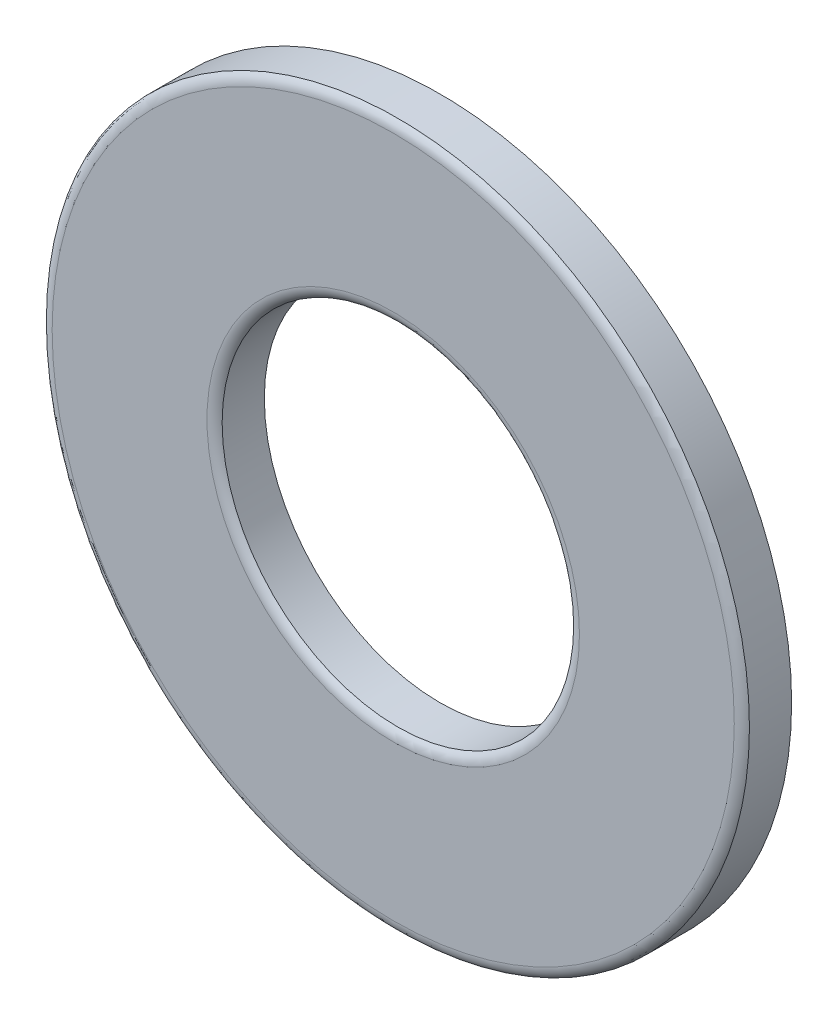
ISO-10303-21;
HEADER;
FILE_DESCRIPTION(('STEP AP214'),'2;1');
FILE_NAME('part.step','',(''),(''),'','','');
FILE_SCHEMA(('AUTOMOTIVE_DESIGN { 1 0 10303 214 1 1 1 1 }'));
ENDSEC;
DATA;
#1=APPLICATION_CONTEXT('core data for automotive mechanical design processes');
#2=APPLICATION_PROTOCOL_DEFINITION('international standard','automotive_design',2000,#1);
#3=PRODUCT_CONTEXT('',#1,'mechanical');
#4=PRODUCT('Part','Part','',(#3));
#5=PRODUCT_RELATED_PRODUCT_CATEGORY('part','',(#4));
#6=PRODUCT_DEFINITION_FORMATION('','',#4);
#7=PRODUCT_DEFINITION_CONTEXT('part definition',#1,'design');
#8=PRODUCT_DEFINITION('design','',#6,#7);
#9=PRODUCT_DEFINITION_SHAPE('','',#8);
#10=(LENGTH_UNIT() NAMED_UNIT(*) SI_UNIT(.MILLI.,.METRE.));
#11=(NAMED_UNIT(*) PLANE_ANGLE_UNIT() SI_UNIT($,.RADIAN.));
#12=(NAMED_UNIT(*) SI_UNIT($,.STERADIAN.) SOLID_ANGLE_UNIT());
#13=UNCERTAINTY_MEASURE_WITH_UNIT(LENGTH_MEASURE(1.E-05),#10,'distance_accuracy_value','');
#14=(GEOMETRIC_REPRESENTATION_CONTEXT(3) GLOBAL_UNCERTAINTY_ASSIGNED_CONTEXT((#13)) GLOBAL_UNIT_ASSIGNED_CONTEXT((#10,
#11,#12)) REPRESENTATION_CONTEXT('',''));
#15=CARTESIAN_POINT('',(0.,0.,0.));
#16=DIRECTION('',(0.,0.,1.));
#17=DIRECTION('',(1.,0.,0.));
#18=AXIS2_PLACEMENT_3D('',#15,#16,#17);
#19=CARTESIAN_POINT('',(0.,0.,0.635000000000001));
#20=DIRECTION('',(0.,0.,1.));
#21=DIRECTION('',(1.,0.,0.));
#22=AXIS2_PLACEMENT_3D('',#19,#20,#21);
#23=PLANE('',#22);
#24=CARTESIAN_POINT('',(0.,0.,0.635000000000001));
#25=DIRECTION('',(0.,0.,1.));
#26=DIRECTION('',(1.,0.,0.));
#27=AXIS2_PLACEMENT_3D('',#24,#25,#26);
#28=CIRCLE('',#27,5.04648063314247);
#29=CARTESIAN_POINT('',(5.04648063314247,0.,0.635000000000001));
#30=VERTEX_POINT('',#29);
#31=EDGE_CURVE('E10',#30,#30,#28,.F.);
#32=ORIENTED_EDGE('',*,*,#31,.T.);
#33=EDGE_LOOP('',(#32));
#34=FACE_BOUND('',#33,.T.);
#35=CARTESIAN_POINT('',(0.,0.,0.635000000000001));
#36=DIRECTION('',(0.,0.,1.));
#37=DIRECTION('',(1.,0.,0.));
#38=AXIS2_PLACEMENT_3D('',#35,#36,#37);
#39=CIRCLE('',#38,9.24101936685753);
#40=CARTESIAN_POINT('',(9.24101936685753,0.,0.635000000000001));
#41=VERTEX_POINT('',#40);
#42=EDGE_CURVE('E52',#41,#41,#39,.T.);
#43=ORIENTED_EDGE('',*,*,#42,.T.);
#44=EDGE_LOOP('',(#43));
#45=FACE_BOUND('',#44,.T.);
#46=ADVANCED_FACE('F44',(#34,#45),#23,.T.);
#47=CARTESIAN_POINT('',(0.,0.,-0.634999999999999));
#48=DIRECTION('',(0.,0.,1.));
#49=DIRECTION('',(1.,0.,0.));
#50=AXIS2_PLACEMENT_3D('',#47,#48,#49);
#51=PLANE('',#50);
#52=CARTESIAN_POINT('',(0.,0.,-0.634999999999999));
#53=DIRECTION('',(0.,0.,1.));
#54=DIRECTION('',(1.,0.,0.));
#55=AXIS2_PLACEMENT_3D('',#52,#53,#54);
#56=CIRCLE('',#55,9.525);
#57=CARTESIAN_POINT('',(9.525,0.,-0.634999999999999));
#58=VERTEX_POINT('',#57);
#59=EDGE_CURVE('E72',#58,#58,#56,.T.);
#60=ORIENTED_EDGE('',*,*,#59,.F.);
#61=EDGE_LOOP('',(#60));
#62=FACE_BOUND('',#61,.T.);
#63=CARTESIAN_POINT('',(0.,0.,-0.634999999999999));
#64=DIRECTION('',(0.,0.,1.));
#65=DIRECTION('',(1.,0.,0.));
#66=AXIS2_PLACEMENT_3D('',#63,#64,#65);
#67=CIRCLE('',#66,4.7625);
#68=CARTESIAN_POINT('',(4.7625,0.,-0.634999999999999));
#69=VERTEX_POINT('',#68);
#70=EDGE_CURVE('E77',#69,#69,#67,.T.);
#71=ORIENTED_EDGE('',*,*,#70,.T.);
#72=EDGE_LOOP('',(#71));
#73=FACE_BOUND('',#72,.T.);
#74=ADVANCED_FACE('F84',(#62,#73),#51,.F.);
#75=CARTESIAN_POINT('',(0.,0.,0.635000000000001));
#76=DIRECTION('',(0.,0.,-1.));
#77=DIRECTION('',(-1.,0.,0.));
#78=AXIS2_PLACEMENT_3D('',#75,#76,#77);
#79=CYLINDRICAL_SURFACE('',#78,9.525);
#80=CARTESIAN_POINT('',(0.,0.,0.508000000000005));
#81=DIRECTION('',(0.,0.,1.));
#82=DIRECTION('',(1.,0.,0.));
#83=AXIS2_PLACEMENT_3D('',#80,#81,#82);
#84=CIRCLE('',#83,9.525);
#85=CARTESIAN_POINT('',(9.525,0.,0.508000000000005));
#86=VERTEX_POINT('',#85);
#87=EDGE_CURVE('E68',#86,#86,#84,.F.);
#88=ORIENTED_EDGE('',*,*,#87,.T.);
#89=EDGE_LOOP('',(#88));
#90=FACE_BOUND('',#89,.T.);
#91=ORIENTED_EDGE('',*,*,#59,.T.);
#92=EDGE_LOOP('',(#91));
#93=FACE_BOUND('',#92,.T.);
#94=ADVANCED_FACE('F86',(#90,#93),#79,.T.);
#95=CARTESIAN_POINT('',(0.,0.,0.635000000000001));
#96=DIRECTION('',(0.,0.,-1.));
#97=DIRECTION('',(-1.,0.,0.));
#98=AXIS2_PLACEMENT_3D('',#95,#96,#97);
#99=CYLINDRICAL_SURFACE('',#98,4.7625);
#100=CARTESIAN_POINT('',(0.,0.,0.508000000000002));
#101=DIRECTION('',(0.,0.,1.));
#102=DIRECTION('',(1.,0.,0.));
#103=AXIS2_PLACEMENT_3D('',#100,#101,#102);
#104=CIRCLE('',#103,4.7625);
#105=CARTESIAN_POINT('',(4.7625,0.,0.508000000000002));
#106=VERTEX_POINT('',#105);
#107=EDGE_CURVE('E64',#106,#106,#104,.T.);
#108=ORIENTED_EDGE('',*,*,#107,.T.);
#109=EDGE_LOOP('',(#108));
#110=FACE_BOUND('',#109,.T.);
#111=ORIENTED_EDGE('',*,*,#70,.F.);
#112=EDGE_LOOP('',(#111));
#113=FACE_BOUND('',#112,.T.);
#114=ADVANCED_FACE('F85',(#110,#113),#99,.F.);
#115=CARTESIAN_POINT('',(0.,0.,0.254000000000001));
#116=DIRECTION('',(0.,0.,1.));
#117=DIRECTION('',(1.,0.,0.));
#118=AXIS2_PLACEMENT_3D('',#115,#116,#117);
#119=TOROIDAL_SURFACE('',#118,5.04648063314247,0.381);
#120=ORIENTED_EDGE('',*,*,#107,.F.);
#121=EDGE_LOOP('',(#120));
#122=FACE_BOUND('',#121,.T.);
#123=ORIENTED_EDGE('',*,*,#31,.F.);
#124=EDGE_LOOP('',(#123));
#125=FACE_BOUND('',#124,.T.);
#126=ADVANCED_FACE('F82',(#122,#125),#119,.T.);
#127=CARTESIAN_POINT('',(0.,0.,0.254000000000001));
#128=DIRECTION('',(0.,0.,-1.));
#129=DIRECTION('',(-1.,0.,0.));
#130=AXIS2_PLACEMENT_3D('',#127,#128,#129);
#131=TOROIDAL_SURFACE('',#130,9.24101936685753,0.381);
#132=ORIENTED_EDGE('',*,*,#87,.F.);
#133=EDGE_LOOP('',(#132));
#134=FACE_BOUND('',#133,.T.);
#135=ORIENTED_EDGE('',*,*,#42,.F.);
#136=EDGE_LOOP('',(#135));
#137=FACE_BOUND('',#136,.T.);
#138=ADVANCED_FACE('F50',(#134,#137),#131,.T.);
#139=CLOSED_SHELL('',(#46,#74,#94,#114,#126,#138));
#140=MANIFOLD_SOLID_BREP('B2',#139);
#141=ADVANCED_BREP_SHAPE_REPRESENTATION('',(#18,#140),#14);
#142=SHAPE_DEFINITION_REPRESENTATION(#9,#141);
ENDSEC;
END-ISO-10303-21;
